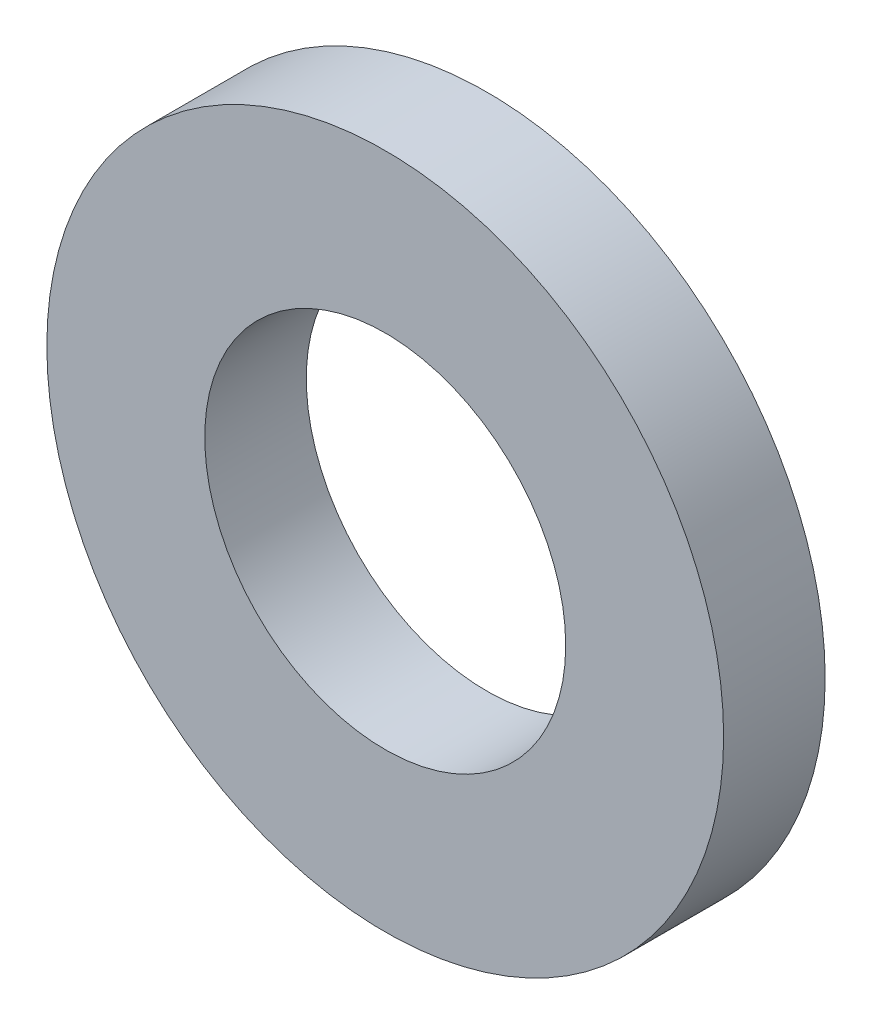
ISO-10303-21;
HEADER;
FILE_DESCRIPTION(('STEP AP214'),'2;1');
FILE_NAME('part.step','',(''),(''),'','','');
FILE_SCHEMA(('AUTOMOTIVE_DESIGN { 1 0 10303 214 1 1 1 1 }'));
ENDSEC;
DATA;
#1=APPLICATION_CONTEXT('core data for automotive mechanical design processes');
#2=APPLICATION_PROTOCOL_DEFINITION('international standard','automotive_design',2000,#1);
#3=PRODUCT_CONTEXT('',#1,'mechanical');
#4=PRODUCT('Part','Part','',(#3));
#5=PRODUCT_RELATED_PRODUCT_CATEGORY('part','',(#4));
#6=PRODUCT_DEFINITION_FORMATION('','',#4);
#7=PRODUCT_DEFINITION_CONTEXT('part definition',#1,'design');
#8=PRODUCT_DEFINITION('design','',#6,#7);
#9=PRODUCT_DEFINITION_SHAPE('','',#8);
#10=(LENGTH_UNIT() NAMED_UNIT(*) SI_UNIT(.MILLI.,.METRE.));
#11=(NAMED_UNIT(*) PLANE_ANGLE_UNIT() SI_UNIT($,.RADIAN.));
#12=(NAMED_UNIT(*) SI_UNIT($,.STERADIAN.) SOLID_ANGLE_UNIT());
#13=UNCERTAINTY_MEASURE_WITH_UNIT(LENGTH_MEASURE(1.E-05),#10,'distance_accuracy_value','');
#14=(GEOMETRIC_REPRESENTATION_CONTEXT(3) GLOBAL_UNCERTAINTY_ASSIGNED_CONTEXT((#13)) GLOBAL_UNIT_ASSIGNED_CONTEXT((#10,
#11,#12)) REPRESENTATION_CONTEXT('',''));
#15=CARTESIAN_POINT('',(0.,0.,0.));
#16=DIRECTION('',(0.,0.,1.));
#17=DIRECTION('',(1.,0.,0.));
#18=AXIS2_PLACEMENT_3D('',#15,#16,#17);
#19=CARTESIAN_POINT('',(0.,0.,1.8));
#20=DIRECTION('',(0.,0.,1.));
#21=DIRECTION('',(1.,0.,0.));
#22=AXIS2_PLACEMENT_3D('',#19,#20,#21);
#23=PLANE('',#22);
#24=CARTESIAN_POINT('',(0.,0.,1.8));
#25=DIRECTION('',(0.,0.,1.));
#26=DIRECTION('',(1.,0.,0.));
#27=AXIS2_PLACEMENT_3D('',#24,#25,#26);
#28=CIRCLE('',#27,6.);
#29=CARTESIAN_POINT('',(6.,0.,1.8));
#30=VERTEX_POINT('',#29);
#31=EDGE_CURVE('E10',#30,#30,#28,.T.);
#32=ORIENTED_EDGE('',*,*,#31,.T.);
#33=EDGE_LOOP('',(#32));
#34=FACE_BOUND('',#33,.T.);
#35=CARTESIAN_POINT('',(0.,0.,1.8));
#36=DIRECTION('',(0.,0.,1.));
#37=DIRECTION('',(1.,0.,0.));
#38=AXIS2_PLACEMENT_3D('',#35,#36,#37);
#39=CIRCLE('',#38,3.2);
#40=CARTESIAN_POINT('',(3.2,0.,1.8));
#41=VERTEX_POINT('',#40);
#42=EDGE_CURVE('E55',#41,#41,#39,.T.);
#43=ORIENTED_EDGE('',*,*,#42,.F.);
#44=EDGE_LOOP('',(#43));
#45=FACE_BOUND('',#44,.T.);
#46=ADVANCED_FACE('F41',(#34,#45),#23,.T.);
#47=CARTESIAN_POINT('',(0.,0.,0.));
#48=DIRECTION('',(0.,0.,1.));
#49=DIRECTION('',(1.,0.,0.));
#50=AXIS2_PLACEMENT_3D('',#47,#48,#49);
#51=PLANE('',#50);
#52=CARTESIAN_POINT('',(0.,0.,0.));
#53=DIRECTION('',(0.,0.,1.));
#54=DIRECTION('',(1.,0.,0.));
#55=AXIS2_PLACEMENT_3D('',#52,#53,#54);
#56=CIRCLE('',#55,6.);
#57=CARTESIAN_POINT('',(6.,0.,0.));
#58=VERTEX_POINT('',#57);
#59=EDGE_CURVE('E45',#58,#58,#56,.T.);
#60=ORIENTED_EDGE('',*,*,#59,.F.);
#61=EDGE_LOOP('',(#60));
#62=FACE_BOUND('',#61,.T.);
#63=CARTESIAN_POINT('',(0.,0.,0.));
#64=DIRECTION('',(0.,0.,1.));
#65=DIRECTION('',(1.,0.,0.));
#66=AXIS2_PLACEMENT_3D('',#63,#64,#65);
#67=CIRCLE('',#66,3.2);
#68=CARTESIAN_POINT('',(3.2,0.,0.));
#69=VERTEX_POINT('',#68);
#70=EDGE_CURVE('E57',#69,#69,#67,.T.);
#71=ORIENTED_EDGE('',*,*,#70,.T.);
#72=EDGE_LOOP('',(#71));
#73=FACE_BOUND('',#72,.T.);
#74=ADVANCED_FACE('F70',(#62,#73),#51,.F.);
#75=CARTESIAN_POINT('',(0.,0.,1.8));
#76=DIRECTION('',(0.,0.,-1.));
#77=DIRECTION('',(-1.,0.,0.));
#78=AXIS2_PLACEMENT_3D('',#75,#76,#77);
#79=CYLINDRICAL_SURFACE('',#78,6.);
#80=ORIENTED_EDGE('',*,*,#31,.F.);
#81=EDGE_LOOP('',(#80));
#82=FACE_BOUND('',#81,.T.);
#83=ORIENTED_EDGE('',*,*,#59,.T.);
#84=EDGE_LOOP('',(#83));
#85=FACE_BOUND('',#84,.T.);
#86=ADVANCED_FACE('F43',(#82,#85),#79,.T.);
#87=CARTESIAN_POINT('',(0.,0.,1.8));
#88=DIRECTION('',(0.,0.,-1.));
#89=DIRECTION('',(-1.,0.,0.));
#90=AXIS2_PLACEMENT_3D('',#87,#88,#89);
#91=CYLINDRICAL_SURFACE('',#90,3.2);
#92=ORIENTED_EDGE('',*,*,#42,.T.);
#93=EDGE_LOOP('',(#92));
#94=FACE_BOUND('',#93,.T.);
#95=ORIENTED_EDGE('',*,*,#70,.F.);
#96=EDGE_LOOP('',(#95));
#97=FACE_BOUND('',#96,.T.);
#98=ADVANCED_FACE('F66',(#94,#97),#91,.F.);
#99=CLOSED_SHELL('',(#46,#74,#86,#98));
#100=MANIFOLD_SOLID_BREP('B2',#99);
#101=ADVANCED_BREP_SHAPE_REPRESENTATION('',(#18,#100),#14);
#102=SHAPE_DEFINITION_REPRESENTATION(#9,#101);
ENDSEC;
END-ISO-10303-21;
